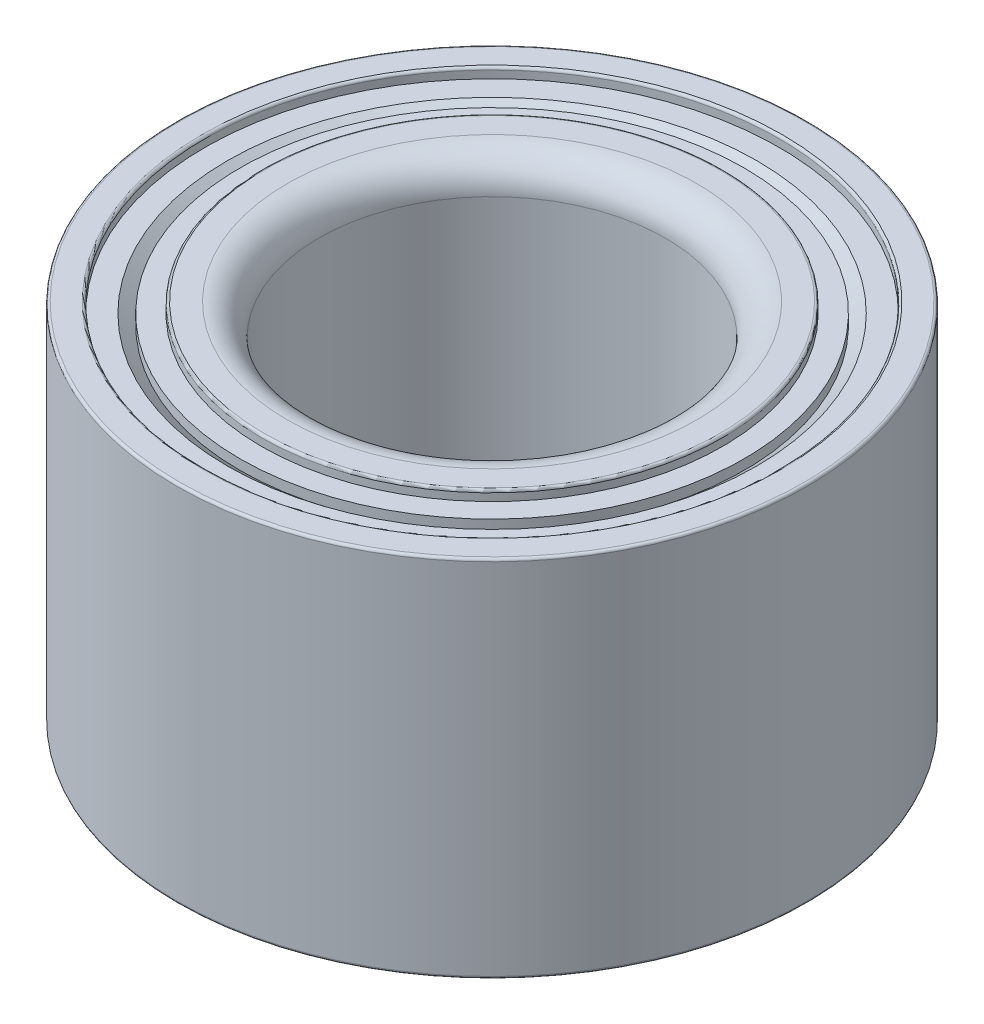
ISO-10303-21;
HEADER;
FILE_DESCRIPTION(('STEP AP214'),'2;1');
FILE_NAME('part.step','',(''),(''),'','','');
FILE_SCHEMA(('AUTOMOTIVE_DESIGN { 1 0 10303 214 1 1 1 1 }'));
ENDSEC;
DATA;
#1=APPLICATION_CONTEXT('core data for automotive mechanical design processes');
#2=APPLICATION_PROTOCOL_DEFINITION('international standard','automotive_design',2000,#1);
#3=PRODUCT_CONTEXT('',#1,'mechanical');
#4=PRODUCT('Part','Part','',(#3));
#5=PRODUCT_RELATED_PRODUCT_CATEGORY('part','',(#4));
#6=PRODUCT_DEFINITION_FORMATION('','',#4);
#7=PRODUCT_DEFINITION_CONTEXT('part definition',#1,'design');
#8=PRODUCT_DEFINITION('design','',#6,#7);
#9=PRODUCT_DEFINITION_SHAPE('','',#8);
#10=(LENGTH_UNIT() NAMED_UNIT(*) SI_UNIT(.MILLI.,.METRE.));
#11=(NAMED_UNIT(*) PLANE_ANGLE_UNIT() SI_UNIT($,.RADIAN.));
#12=(NAMED_UNIT(*) SI_UNIT($,.STERADIAN.) SOLID_ANGLE_UNIT());
#13=UNCERTAINTY_MEASURE_WITH_UNIT(LENGTH_MEASURE(1.E-05),#10,'distance_accuracy_value','');
#14=(GEOMETRIC_REPRESENTATION_CONTEXT(3) GLOBAL_UNCERTAINTY_ASSIGNED_CONTEXT((#13)) GLOBAL_UNIT_ASSIGNED_CONTEXT((#10,
#11,#12)) REPRESENTATION_CONTEXT('',''));
#15=CARTESIAN_POINT('',(0.,0.,0.));
#16=DIRECTION('',(0.,0.,1.));
#17=DIRECTION('',(1.,0.,0.));
#18=AXIS2_PLACEMENT_3D('',#15,#16,#17);
#19=CARTESIAN_POINT('',(0.,17.3355,0.));
#20=DIRECTION('',(0.,1.,0.));
#21=DIRECTION('',(0.,0.,1.));
#22=AXIS2_PLACEMENT_3D('',#19,#20,#21);
#23=PLANE('',#22);
#24=CARTESIAN_POINT('',(0.,17.3355,0.));
#25=DIRECTION('',(0.,1.,0.));
#26=DIRECTION('',(0.,0.,1.));
#27=AXIS2_PLACEMENT_3D('',#24,#25,#26);
#28=CIRCLE('',#27,23.241);
#29=CARTESIAN_POINT('',(0.,17.3355,23.241));
#30=VERTEX_POINT('',#29);
#31=EDGE_CURVE('E95',#30,#30,#28,.T.);
#32=ORIENTED_EDGE('',*,*,#31,.F.);
#33=EDGE_LOOP('',(#32));
#34=FACE_BOUND('',#33,.T.);
#35=CARTESIAN_POINT('',(0.,17.3355,0.));
#36=DIRECTION('',(0.,-1.,0.));
#37=DIRECTION('',(0.,0.,-1.));
#38=AXIS2_PLACEMENT_3D('',#35,#36,#37);
#39=CIRCLE('',#38,25.4);
#40=CARTESIAN_POINT('',(0.,17.3355,-25.4));
#41=VERTEX_POINT('',#40);
#42=EDGE_CURVE('E111',#41,#41,#39,.T.);
#43=ORIENTED_EDGE('',*,*,#42,.F.);
#44=EDGE_LOOP('',(#43));
#45=FACE_BOUND('',#44,.T.);
#46=ADVANCED_FACE('F36',(#34,#45),#23,.T.);
#47=CARTESIAN_POINT('',(0.,-17.3355,0.));
#48=DIRECTION('',(0.,-1.,0.));
#49=DIRECTION('',(0.,0.,1.));
#50=AXIS2_PLACEMENT_3D('',#47,#48,#49);
#51=PLANE('',#50);
#52=CARTESIAN_POINT('',(0.,-17.3355,0.));
#53=DIRECTION('',(0.,1.,0.));
#54=DIRECTION('',(0.,0.,1.));
#55=AXIS2_PLACEMENT_3D('',#52,#53,#54);
#56=CIRCLE('',#55,23.241);
#57=CARTESIAN_POINT('',(0.,-17.3355,23.241));
#58=VERTEX_POINT('',#57);
#59=EDGE_CURVE('E101',#58,#58,#56,.T.);
#60=ORIENTED_EDGE('',*,*,#59,.T.);
#61=EDGE_LOOP('',(#60));
#62=FACE_BOUND('',#61,.T.);
#63=CARTESIAN_POINT('',(0.,-17.3355,0.));
#64=DIRECTION('',(0.,-1.,0.));
#65=DIRECTION('',(0.,0.,-1.));
#66=AXIS2_PLACEMENT_3D('',#63,#64,#65);
#67=CIRCLE('',#66,25.4);
#68=CARTESIAN_POINT('',(0.,-17.3355,-25.4));
#69=VERTEX_POINT('',#68);
#70=EDGE_CURVE('E107',#69,#69,#67,.T.);
#71=ORIENTED_EDGE('',*,*,#70,.T.);
#72=EDGE_LOOP('',(#71));
#73=FACE_BOUND('',#72,.T.);
#74=ADVANCED_FACE('F143',(#62,#73),#51,.T.);
#75=CARTESIAN_POINT('',(0.,-18.3515,0.));
#76=DIRECTION('',(0.,1.,0.));
#77=DIRECTION('',(0.,0.,1.));
#78=AXIS2_PLACEMENT_3D('',#75,#76,#77);
#79=PLANE('',#78);
#80=CARTESIAN_POINT('',(0.,-18.3515,0.));
#81=DIRECTION('',(0.,1.,0.));
#82=DIRECTION('',(0.,0.,1.));
#83=AXIS2_PLACEMENT_3D('',#80,#81,#82);
#84=CIRCLE('',#83,22.987);
#85=CARTESIAN_POINT('',(0.,-18.3515,22.987));
#86=VERTEX_POINT('',#85);
#87=EDGE_CURVE('E68',#86,#86,#84,.F.);
#88=ORIENTED_EDGE('',*,*,#87,.T.);
#89=EDGE_LOOP('',(#88));
#90=FACE_BOUND('',#89,.T.);
#91=CARTESIAN_POINT('',(0.,-18.3515,0.));
#92=DIRECTION('',(0.,1.,0.));
#93=DIRECTION('',(0.,0.,1.));
#94=AXIS2_PLACEMENT_3D('',#91,#92,#93);
#95=CIRCLE('',#94,20.6375);
#96=CARTESIAN_POINT('',(0.,-18.3515,20.6375));
#97=VERTEX_POINT('',#96);
#98=EDGE_CURVE('E80',#97,#97,#95,.T.);
#99=ORIENTED_EDGE('',*,*,#98,.T.);
#100=EDGE_LOOP('',(#99));
#101=FACE_BOUND('',#100,.T.);
#102=ADVANCED_FACE('F150',(#90,#101),#79,.F.);
#103=CARTESIAN_POINT('',(0.,18.3515,0.));
#104=DIRECTION('',(0.,1.,0.));
#105=DIRECTION('',(0.,0.,1.));
#106=AXIS2_PLACEMENT_3D('',#103,#104,#105);
#107=PLANE('',#106);
#108=CARTESIAN_POINT('',(0.,18.3515,0.));
#109=DIRECTION('',(0.,1.,0.));
#110=DIRECTION('',(0.,0.,1.));
#111=AXIS2_PLACEMENT_3D('',#108,#109,#110);
#112=CIRCLE('',#111,22.987);
#113=CARTESIAN_POINT('',(0.,18.3515,22.987));
#114=VERTEX_POINT('',#113);
#115=EDGE_CURVE('E77',#114,#114,#112,.T.);
#116=ORIENTED_EDGE('',*,*,#115,.T.);
#117=EDGE_LOOP('',(#116));
#118=FACE_BOUND('',#117,.T.);
#119=CARTESIAN_POINT('',(0.,18.3515,0.));
#120=DIRECTION('',(0.,1.,0.));
#121=DIRECTION('',(0.,0.,1.));
#122=AXIS2_PLACEMENT_3D('',#119,#120,#121);
#123=CIRCLE('',#122,20.6375);
#124=CARTESIAN_POINT('',(0.,18.3515,20.6375));
#125=VERTEX_POINT('',#124);
#126=EDGE_CURVE('E83',#125,#125,#123,.F.);
#127=ORIENTED_EDGE('',*,*,#126,.T.);
#128=EDGE_LOOP('',(#127));
#129=FACE_BOUND('',#128,.T.);
#130=ADVANCED_FACE('F229',(#118,#129),#107,.T.);
#131=CARTESIAN_POINT('',(0.,-18.3515,0.));
#132=DIRECTION('',(0.,1.,0.));
#133=DIRECTION('',(0.,0.,1.));
#134=AXIS2_PLACEMENT_3D('',#131,#132,#133);
#135=CYLINDRICAL_SURFACE('',#134,31.75);
#136=CARTESIAN_POINT('',(0.,-18.0975,0.));
#137=DIRECTION('',(0.,1.,0.));
#138=DIRECTION('',(0.,0.,1.));
#139=AXIS2_PLACEMENT_3D('',#136,#137,#138);
#140=CIRCLE('',#139,31.75);
#141=CARTESIAN_POINT('',(0.,-18.0975,31.75));
#142=VERTEX_POINT('',#141);
#143=EDGE_CURVE('E51',#142,#142,#140,.T.);
#144=ORIENTED_EDGE('',*,*,#143,.T.);
#145=EDGE_LOOP('',(#144));
#146=FACE_BOUND('',#145,.T.);
#147=CARTESIAN_POINT('',(0.,18.0975,0.));
#148=DIRECTION('',(0.,1.,0.));
#149=DIRECTION('',(0.,0.,1.));
#150=AXIS2_PLACEMENT_3D('',#147,#148,#149);
#151=CIRCLE('',#150,31.75);
#152=CARTESIAN_POINT('',(0.,18.0975,31.75));
#153=VERTEX_POINT('',#152);
#154=EDGE_CURVE('E56',#153,#153,#151,.F.);
#155=ORIENTED_EDGE('',*,*,#154,.T.);
#156=EDGE_LOOP('',(#155));
#157=FACE_BOUND('',#156,.T.);
#158=ADVANCED_FACE('F217',(#146,#157),#135,.T.);
#159=CARTESIAN_POINT('',(0.,-18.3515,0.));
#160=DIRECTION('',(0.,1.,0.));
#161=DIRECTION('',(0.,0.,1.));
#162=AXIS2_PLACEMENT_3D('',#159,#160,#161);
#163=CIRCLE('',#162,29.21);
#164=CARTESIAN_POINT('',(0.,-18.3515,29.21));
#165=VERTEX_POINT('',#164);
#166=EDGE_CURVE('E62',#165,#165,#163,.T.);
#167=ORIENTED_EDGE('',*,*,#166,.T.);
#168=EDGE_LOOP('',(#167));
#169=FACE_BOUND('',#168,.T.);
#170=CARTESIAN_POINT('',(0.,-18.3515,0.));
#171=DIRECTION('',(0.,1.,0.));
#172=DIRECTION('',(0.,0.,1.));
#173=AXIS2_PLACEMENT_3D('',#170,#171,#172);
#174=CIRCLE('',#173,31.496);
#175=CARTESIAN_POINT('',(0.,-18.3515,31.496));
#176=VERTEX_POINT('',#175);
#177=EDGE_CURVE('E65',#176,#176,#174,.F.);
#178=ORIENTED_EDGE('',*,*,#177,.T.);
#179=EDGE_LOOP('',(#178));
#180=FACE_BOUND('',#179,.T.);
#181=ADVANCED_FACE('F213',(#169,#180),#79,.F.);
#182=CARTESIAN_POINT('',(0.,-18.3515,0.));
#183=DIRECTION('',(0.,1.,0.));
#184=DIRECTION('',(0.,0.,1.));
#185=AXIS2_PLACEMENT_3D('',#182,#183,#184);
#186=CYLINDRICAL_SURFACE('',#185,17.4625);
#187=CARTESIAN_POINT('',(0.,15.1765,0.));
#188=DIRECTION('',(0.,1.,0.));
#189=DIRECTION('',(0.,0.,1.));
#190=AXIS2_PLACEMENT_3D('',#187,#188,#189);
#191=CIRCLE('',#190,17.4625);
#192=CARTESIAN_POINT('',(0.,15.1765,17.4625));
#193=VERTEX_POINT('',#192);
#194=EDGE_CURVE('E86',#193,#193,#191,.T.);
#195=ORIENTED_EDGE('',*,*,#194,.T.);
#196=EDGE_LOOP('',(#195));
#197=FACE_BOUND('',#196,.T.);
#198=CARTESIAN_POINT('',(0.,-15.1765,0.));
#199=DIRECTION('',(0.,1.,0.));
#200=DIRECTION('',(0.,0.,1.));
#201=AXIS2_PLACEMENT_3D('',#198,#199,#200);
#202=CIRCLE('',#201,17.4625);
#203=CARTESIAN_POINT('',(0.,-15.1765,17.4625));
#204=VERTEX_POINT('',#203);
#205=EDGE_CURVE('E89',#204,#204,#202,.F.);
#206=ORIENTED_EDGE('',*,*,#205,.T.);
#207=EDGE_LOOP('',(#206));
#208=FACE_BOUND('',#207,.T.);
#209=ADVANCED_FACE('F216',(#197,#208),#186,.F.);
#210=CARTESIAN_POINT('',(0.,18.3515,0.));
#211=DIRECTION('',(0.,1.,0.));
#212=DIRECTION('',(0.,0.,1.));
#213=AXIS2_PLACEMENT_3D('',#210,#211,#212);
#214=CIRCLE('',#213,29.21);
#215=CARTESIAN_POINT('',(0.,18.3515,29.21));
#216=VERTEX_POINT('',#215);
#217=EDGE_CURVE('E10',#216,#216,#214,.F.);
#218=ORIENTED_EDGE('',*,*,#217,.T.);
#219=EDGE_LOOP('',(#218));
#220=FACE_BOUND('',#219,.T.);
#221=CARTESIAN_POINT('',(0.,18.3515,0.));
#222=DIRECTION('',(0.,1.,0.));
#223=DIRECTION('',(0.,0.,1.));
#224=AXIS2_PLACEMENT_3D('',#221,#222,#223);
#225=CIRCLE('',#224,31.496);
#226=CARTESIAN_POINT('',(0.,18.3515,31.496));
#227=VERTEX_POINT('',#226);
#228=EDGE_CURVE('E43',#227,#227,#225,.T.);
#229=ORIENTED_EDGE('',*,*,#228,.T.);
#230=EDGE_LOOP('',(#229));
#231=FACE_BOUND('',#230,.T.);
#232=ADVANCED_FACE('F167',(#220,#231),#107,.T.);
#233=CARTESIAN_POINT('',(0.,17.3355,0.));
#234=DIRECTION('',(0.,1.,0.));
#235=DIRECTION('',(0.,0.,1.));
#236=AXIS2_PLACEMENT_3D('',#233,#234,#235);
#237=CYLINDRICAL_SURFACE('',#236,28.956);
#238=CARTESIAN_POINT('',(0.,18.0975,0.));
#239=DIRECTION('',(0.,1.,0.));
#240=DIRECTION('',(0.,0.,1.));
#241=AXIS2_PLACEMENT_3D('',#238,#239,#240);
#242=CIRCLE('',#241,28.956);
#243=CARTESIAN_POINT('',(0.,18.0975,28.956));
#244=VERTEX_POINT('',#243);
#245=EDGE_CURVE('E47',#244,#244,#242,.T.);
#246=ORIENTED_EDGE('',*,*,#245,.T.);
#247=EDGE_LOOP('',(#246));
#248=FACE_BOUND('',#247,.T.);
#249=CARTESIAN_POINT('',(0.,17.3355,0.));
#250=DIRECTION('',(0.,1.,0.));
#251=DIRECTION('',(0.,0.,1.));
#252=AXIS2_PLACEMENT_3D('',#249,#250,#251);
#253=CIRCLE('',#252,28.956);
#254=CARTESIAN_POINT('',(0.,17.3355,28.956));
#255=VERTEX_POINT('',#254);
#256=EDGE_CURVE('E92',#255,#255,#253,.T.);
#257=ORIENTED_EDGE('',*,*,#256,.F.);
#258=EDGE_LOOP('',(#257));
#259=FACE_BOUND('',#258,.T.);
#260=ADVANCED_FACE('F160',(#248,#259),#237,.F.);
#261=CARTESIAN_POINT('',(0.,17.3355,0.));
#262=DIRECTION('',(0.,-1.,0.));
#263=DIRECTION('',(0.,0.,-1.));
#264=AXIS2_PLACEMENT_3D('',#261,#262,#263);
#265=CIRCLE('',#264,26.67);
#266=CARTESIAN_POINT('',(0.,17.3355,-26.67));
#267=VERTEX_POINT('',#266);
#268=EDGE_CURVE('E114',#267,#267,#265,.T.);
#269=ORIENTED_EDGE('',*,*,#268,.T.);
#270=EDGE_LOOP('',(#269));
#271=FACE_BOUND('',#270,.T.);
#272=ORIENTED_EDGE('',*,*,#256,.T.);
#273=EDGE_LOOP('',(#272));
#274=FACE_BOUND('',#273,.T.);
#275=ADVANCED_FACE('F146',(#271,#274),#23,.T.);
#276=CARTESIAN_POINT('',(0.,17.3355,0.));
#277=DIRECTION('',(0.,1.,0.));
#278=DIRECTION('',(0.,0.,1.));
#279=AXIS2_PLACEMENT_3D('',#276,#277,#278);
#280=CYLINDRICAL_SURFACE('',#279,23.241);
#281=CARTESIAN_POINT('',(0.,18.0975,0.));
#282=DIRECTION('',(0.,1.,0.));
#283=DIRECTION('',(0.,0.,1.));
#284=AXIS2_PLACEMENT_3D('',#281,#282,#283);
#285=CIRCLE('',#284,23.241);
#286=CARTESIAN_POINT('',(0.,18.0975,23.241));
#287=VERTEX_POINT('',#286);
#288=EDGE_CURVE('E74',#287,#287,#285,.F.);
#289=ORIENTED_EDGE('',*,*,#288,.T.);
#290=EDGE_LOOP('',(#289));
#291=FACE_BOUND('',#290,.T.);
#292=ORIENTED_EDGE('',*,*,#31,.T.);
#293=EDGE_LOOP('',(#292));
#294=FACE_BOUND('',#293,.T.);
#295=ADVANCED_FACE('F159',(#291,#294),#280,.T.);
#296=CARTESIAN_POINT('',(0.,-17.3355,0.));
#297=DIRECTION('',(0.,-1.,0.));
#298=DIRECTION('',(0.,0.,-1.));
#299=AXIS2_PLACEMENT_3D('',#296,#297,#298);
#300=CIRCLE('',#299,26.67);
#301=CARTESIAN_POINT('',(0.,-17.3355,-26.67));
#302=VERTEX_POINT('',#301);
#303=EDGE_CURVE('E104',#302,#302,#300,.T.);
#304=ORIENTED_EDGE('',*,*,#303,.F.);
#305=EDGE_LOOP('',(#304));
#306=FACE_BOUND('',#305,.T.);
#307=CARTESIAN_POINT('',(0.,-17.3355,0.));
#308=DIRECTION('',(0.,1.,0.));
#309=DIRECTION('',(0.,0.,1.));
#310=AXIS2_PLACEMENT_3D('',#307,#308,#309);
#311=CIRCLE('',#310,28.956);
#312=CARTESIAN_POINT('',(0.,-17.3355,28.956));
#313=VERTEX_POINT('',#312);
#314=EDGE_CURVE('E98',#313,#313,#311,.T.);
#315=ORIENTED_EDGE('',*,*,#314,.F.);
#316=EDGE_LOOP('',(#315));
#317=FACE_BOUND('',#316,.T.);
#318=ADVANCED_FACE('F153',(#306,#317),#51,.T.);
#319=CARTESIAN_POINT('',(0.,-17.3355,0.));
#320=DIRECTION('',(0.,-1.,0.));
#321=DIRECTION('',(0.,0.,-1.));
#322=AXIS2_PLACEMENT_3D('',#319,#320,#321);
#323=CYLINDRICAL_SURFACE('',#322,28.956);
#324=CARTESIAN_POINT('',(0.,-18.0975,0.));
#325=DIRECTION('',(0.,1.,0.));
#326=DIRECTION('',(0.,0.,1.));
#327=AXIS2_PLACEMENT_3D('',#324,#325,#326);
#328=CIRCLE('',#327,28.956);
#329=CARTESIAN_POINT('',(0.,-18.0975,28.956));
#330=VERTEX_POINT('',#329);
#331=EDGE_CURVE('E59',#330,#330,#328,.F.);
#332=ORIENTED_EDGE('',*,*,#331,.T.);
#333=EDGE_LOOP('',(#332));
#334=FACE_BOUND('',#333,.T.);
#335=ORIENTED_EDGE('',*,*,#314,.T.);
#336=EDGE_LOOP('',(#335));
#337=FACE_BOUND('',#336,.T.);
#338=ADVANCED_FACE('F192',(#334,#337),#323,.F.);
#339=CARTESIAN_POINT('',(0.,-17.3355,0.));
#340=DIRECTION('',(0.,-1.,0.));
#341=DIRECTION('',(0.,0.,-1.));
#342=AXIS2_PLACEMENT_3D('',#339,#340,#341);
#343=CYLINDRICAL_SURFACE('',#342,23.241);
#344=CARTESIAN_POINT('',(0.,-18.0975,0.));
#345=DIRECTION('',(0.,1.,0.));
#346=DIRECTION('',(0.,0.,1.));
#347=AXIS2_PLACEMENT_3D('',#344,#345,#346);
#348=CIRCLE('',#347,23.241);
#349=CARTESIAN_POINT('',(0.,-18.0975,23.241));
#350=VERTEX_POINT('',#349);
#351=EDGE_CURVE('E71',#350,#350,#348,.T.);
#352=ORIENTED_EDGE('',*,*,#351,.T.);
#353=EDGE_LOOP('',(#352));
#354=FACE_BOUND('',#353,.T.);
#355=ORIENTED_EDGE('',*,*,#59,.F.);
#356=EDGE_LOOP('',(#355));
#357=FACE_BOUND('',#356,.T.);
#358=ADVANCED_FACE('F190',(#354,#357),#343,.T.);
#359=CARTESIAN_POINT('',(0.,-16.3195,0.));
#360=DIRECTION('',(0.,-1.,0.));
#361=DIRECTION('',(0.,0.,-1.));
#362=AXIS2_PLACEMENT_3D('',#359,#360,#361);
#363=CYLINDRICAL_SURFACE('',#362,25.4);
#364=CARTESIAN_POINT('',(0.,-16.3195,0.));
#365=DIRECTION('',(0.,-1.,0.));
#366=DIRECTION('',(0.,0.,-1.));
#367=AXIS2_PLACEMENT_3D('',#364,#365,#366);
#368=CIRCLE('',#367,25.4);
#369=CARTESIAN_POINT('',(0.,-16.3195,-25.4));
#370=VERTEX_POINT('',#369);
#371=EDGE_CURVE('E119',#370,#370,#368,.T.);
#372=ORIENTED_EDGE('',*,*,#371,.T.);
#373=EDGE_LOOP('',(#372));
#374=FACE_BOUND('',#373,.T.);
#375=ORIENTED_EDGE('',*,*,#70,.F.);
#376=EDGE_LOOP('',(#375));
#377=FACE_BOUND('',#376,.T.);
#378=ADVANCED_FACE('F123',(#374,#377),#363,.T.);
#379=CARTESIAN_POINT('',(0.,15.1765,0.));
#380=DIRECTION('',(0.,1.,0.));
#381=DIRECTION('',(0.,0.,1.));
#382=AXIS2_PLACEMENT_3D('',#379,#380,#381);
#383=TOROIDAL_SURFACE('',#382,20.6375,3.175);
#384=ORIENTED_EDGE('',*,*,#126,.F.);
#385=EDGE_LOOP('',(#384));
#386=FACE_BOUND('',#385,.T.);
#387=ORIENTED_EDGE('',*,*,#194,.F.);
#388=EDGE_LOOP('',(#387));
#389=FACE_BOUND('',#388,.T.);
#390=ADVANCED_FACE('F184',(#386,#389),#383,.T.);
#391=CARTESIAN_POINT('',(0.,-15.1765,0.));
#392=DIRECTION('',(0.,1.,0.));
#393=DIRECTION('',(0.,0.,1.));
#394=AXIS2_PLACEMENT_3D('',#391,#392,#393);
#395=TOROIDAL_SURFACE('',#394,20.6375,3.175);
#396=ORIENTED_EDGE('',*,*,#205,.F.);
#397=EDGE_LOOP('',(#396));
#398=FACE_BOUND('',#397,.T.);
#399=ORIENTED_EDGE('',*,*,#98,.F.);
#400=EDGE_LOOP('',(#399));
#401=FACE_BOUND('',#400,.T.);
#402=ADVANCED_FACE('F178',(#398,#401),#395,.T.);
#403=CARTESIAN_POINT('',(0.,16.3195,0.));
#404=DIRECTION('',(0.,1.,0.));
#405=DIRECTION('',(0.,0.,1.));
#406=AXIS2_PLACEMENT_3D('',#403,#404,#405);
#407=CYLINDRICAL_SURFACE('',#406,25.4);
#408=CARTESIAN_POINT('',(0.,16.3195,0.));
#409=DIRECTION('',(0.,-1.,0.));
#410=DIRECTION('',(0.,0.,-1.));
#411=AXIS2_PLACEMENT_3D('',#408,#409,#410);
#412=CIRCLE('',#411,25.4);
#413=CARTESIAN_POINT('',(0.,16.3195,-25.4));
#414=VERTEX_POINT('',#413);
#415=EDGE_CURVE('E110',#414,#414,#412,.T.);
#416=ORIENTED_EDGE('',*,*,#415,.F.);
#417=EDGE_LOOP('',(#416));
#418=FACE_BOUND('',#417,.T.);
#419=ORIENTED_EDGE('',*,*,#42,.T.);
#420=EDGE_LOOP('',(#419));
#421=FACE_BOUND('',#420,.T.);
#422=ADVANCED_FACE('F139',(#418,#421),#407,.T.);
#423=CARTESIAN_POINT('',(0.,16.3195,0.));
#424=DIRECTION('',(0.,1.,0.));
#425=DIRECTION('',(0.,0.,1.));
#426=AXIS2_PLACEMENT_3D('',#423,#424,#425);
#427=CONICAL_SURFACE('',#426,25.4,0.896055384571343);
#428=ORIENTED_EDGE('',*,*,#268,.F.);
#429=EDGE_LOOP('',(#428));
#430=FACE_BOUND('',#429,.T.);
#431=ORIENTED_EDGE('',*,*,#415,.T.);
#432=EDGE_LOOP('',(#431));
#433=FACE_BOUND('',#432,.T.);
#434=ADVANCED_FACE('F129',(#430,#433),#427,.F.);
#435=CARTESIAN_POINT('',(0.,-16.3195,0.));
#436=DIRECTION('',(0.,-1.,0.));
#437=DIRECTION('',(0.,0.,1.));
#438=AXIS2_PLACEMENT_3D('',#435,#436,#437);
#439=CONICAL_SURFACE('',#438,25.4,0.896055384571343);
#440=ORIENTED_EDGE('',*,*,#303,.T.);
#441=EDGE_LOOP('',(#440));
#442=FACE_BOUND('',#441,.T.);
#443=ORIENTED_EDGE('',*,*,#371,.F.);
#444=EDGE_LOOP('',(#443));
#445=FACE_BOUND('',#444,.T.);
#446=ADVANCED_FACE('F126',(#442,#445),#439,.F.);
#447=CARTESIAN_POINT('',(0.,18.0975,0.));
#448=DIRECTION('',(0.,1.,0.));
#449=DIRECTION('',(0.,0.,1.));
#450=AXIS2_PLACEMENT_3D('',#447,#448,#449);
#451=TOROIDAL_SURFACE('',#450,22.987,0.254);
#452=ORIENTED_EDGE('',*,*,#288,.F.);
#453=EDGE_LOOP('',(#452));
#454=FACE_BOUND('',#453,.T.);
#455=ORIENTED_EDGE('',*,*,#115,.F.);
#456=EDGE_LOOP('',(#455));
#457=FACE_BOUND('',#456,.T.);
#458=ADVANCED_FACE('F128',(#454,#457),#451,.T.);
#459=CARTESIAN_POINT('',(0.,-18.0975,0.));
#460=DIRECTION('',(0.,1.,0.));
#461=DIRECTION('',(0.,0.,1.));
#462=AXIS2_PLACEMENT_3D('',#459,#460,#461);
#463=TOROIDAL_SURFACE('',#462,22.987,0.254);
#464=ORIENTED_EDGE('',*,*,#87,.F.);
#465=EDGE_LOOP('',(#464));
#466=FACE_BOUND('',#465,.T.);
#467=ORIENTED_EDGE('',*,*,#351,.F.);
#468=EDGE_LOOP('',(#467));
#469=FACE_BOUND('',#468,.T.);
#470=ADVANCED_FACE('F136',(#466,#469),#463,.T.);
#471=CARTESIAN_POINT('',(0.,-18.0975,0.));
#472=DIRECTION('',(0.,1.,0.));
#473=DIRECTION('',(0.,0.,1.));
#474=AXIS2_PLACEMENT_3D('',#471,#472,#473);
#475=TOROIDAL_SURFACE('',#474,29.21,0.254);
#476=ORIENTED_EDGE('',*,*,#331,.F.);
#477=EDGE_LOOP('',(#476));
#478=FACE_BOUND('',#477,.T.);
#479=ORIENTED_EDGE('',*,*,#166,.F.);
#480=EDGE_LOOP('',(#479));
#481=FACE_BOUND('',#480,.T.);
#482=ADVANCED_FACE('F206',(#478,#481),#475,.T.);
#483=CARTESIAN_POINT('',(0.,-18.0975,0.));
#484=DIRECTION('',(0.,1.,0.));
#485=DIRECTION('',(0.,0.,1.));
#486=AXIS2_PLACEMENT_3D('',#483,#484,#485);
#487=TOROIDAL_SURFACE('',#486,31.496,0.254);
#488=ORIENTED_EDGE('',*,*,#177,.F.);
#489=EDGE_LOOP('',(#488));
#490=FACE_BOUND('',#489,.T.);
#491=ORIENTED_EDGE('',*,*,#143,.F.);
#492=EDGE_LOOP('',(#491));
#493=FACE_BOUND('',#492,.T.);
#494=ADVANCED_FACE('F209',(#490,#493),#487,.T.);
#495=CARTESIAN_POINT('',(0.,18.0975,0.));
#496=DIRECTION('',(0.,1.,0.));
#497=DIRECTION('',(0.,0.,1.));
#498=AXIS2_PLACEMENT_3D('',#495,#496,#497);
#499=TOROIDAL_SURFACE('',#498,29.21,0.254);
#500=ORIENTED_EDGE('',*,*,#217,.F.);
#501=EDGE_LOOP('',(#500));
#502=FACE_BOUND('',#501,.T.);
#503=ORIENTED_EDGE('',*,*,#245,.F.);
#504=EDGE_LOOP('',(#503));
#505=FACE_BOUND('',#504,.T.);
#506=ADVANCED_FACE('F223',(#502,#505),#499,.T.);
#507=CARTESIAN_POINT('',(0.,18.0975,0.));
#508=DIRECTION('',(0.,1.,0.));
#509=DIRECTION('',(0.,0.,1.));
#510=AXIS2_PLACEMENT_3D('',#507,#508,#509);
#511=TOROIDAL_SURFACE('',#510,31.496,0.254);
#512=ORIENTED_EDGE('',*,*,#154,.F.);
#513=EDGE_LOOP('',(#512));
#514=FACE_BOUND('',#513,.T.);
#515=ORIENTED_EDGE('',*,*,#228,.F.);
#516=EDGE_LOOP('',(#515));
#517=FACE_BOUND('',#516,.T.);
#518=ADVANCED_FACE('F38',(#514,#517),#511,.T.);
#519=CLOSED_SHELL('',(#46,#74,#102,#130,#158,#181,#209,#232,#260,#275,#295,#318,#338,#358,#378,
#390,#402,#422,#434,#446,#458,#470,#482,#494,#506,#518));
#520=MANIFOLD_SOLID_BREP('B2',#519);
#521=ADVANCED_BREP_SHAPE_REPRESENTATION('',(#18,#520),#14);
#522=SHAPE_DEFINITION_REPRESENTATION(#9,#521);
ENDSEC;
END-ISO-10303-21;
